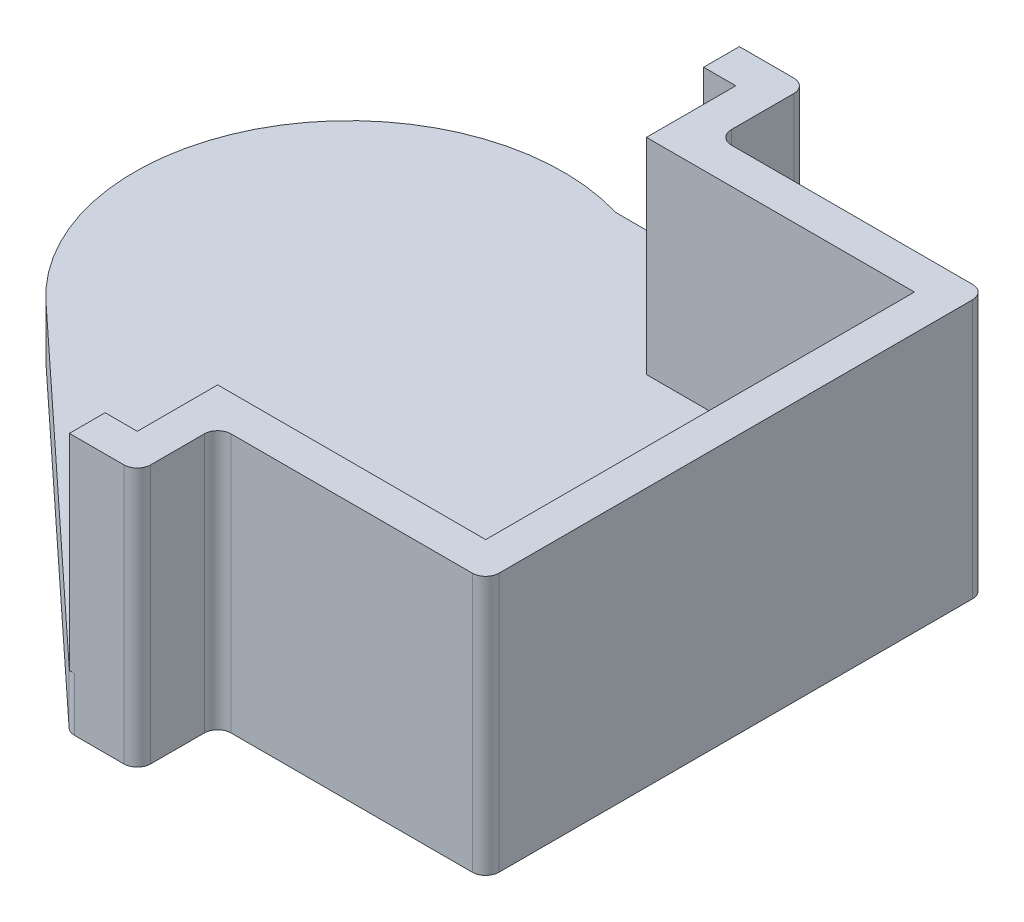
ISO-10303-21;
HEADER;
FILE_DESCRIPTION(('STEP AP214'),'2;1');
FILE_NAME('part.step','',(''),(''),'','','');
FILE_SCHEMA(('AUTOMOTIVE_DESIGN { 1 0 10303 214 1 1 1 1 }'));
ENDSEC;
DATA;
#1=APPLICATION_CONTEXT('core data for automotive mechanical design processes');
#2=APPLICATION_PROTOCOL_DEFINITION('international standard','automotive_design',2000,#1);
#3=PRODUCT_CONTEXT('',#1,'mechanical');
#4=PRODUCT('Part','Part','',(#3));
#5=PRODUCT_RELATED_PRODUCT_CATEGORY('part','',(#4));
#6=PRODUCT_DEFINITION_FORMATION('','',#4);
#7=PRODUCT_DEFINITION_CONTEXT('part definition',#1,'design');
#8=PRODUCT_DEFINITION('design','',#6,#7);
#9=PRODUCT_DEFINITION_SHAPE('','',#8);
#10=(LENGTH_UNIT() NAMED_UNIT(*) SI_UNIT(.MILLI.,.METRE.));
#11=(NAMED_UNIT(*) PLANE_ANGLE_UNIT() SI_UNIT($,.RADIAN.));
#12=(NAMED_UNIT(*) SI_UNIT($,.STERADIAN.) SOLID_ANGLE_UNIT());
#13=UNCERTAINTY_MEASURE_WITH_UNIT(LENGTH_MEASURE(1.E-05),#10,'distance_accuracy_value','');
#14=(GEOMETRIC_REPRESENTATION_CONTEXT(3) GLOBAL_UNCERTAINTY_ASSIGNED_CONTEXT((#13)) GLOBAL_UNIT_ASSIGNED_CONTEXT((#10,
#11,#12)) REPRESENTATION_CONTEXT('',''));
#15=CARTESIAN_POINT('',(0.,0.,0.));
#16=DIRECTION('',(0.,0.,1.));
#17=DIRECTION('',(1.,0.,0.));
#18=AXIS2_PLACEMENT_3D('',#15,#16,#17);
#19=CARTESIAN_POINT('',(6.4,11.5,6.25));
#20=DIRECTION('',(0.,-1.,0.));
#21=DIRECTION('',(0.,0.,-1.));
#22=AXIS2_PLACEMENT_3D('',#19,#20,#21);
#23=CYLINDRICAL_SURFACE('',#22,0.75);
#24=DIRECTION('',(0.,-1.,0.));
#25=VECTOR('',#24,1.);
#26=CARTESIAN_POINT('',(6.39999999999999,11.5,7.));
#27=LINE('',#26,#25);
#28=CARTESIAN_POINT('',(6.39999999999999,11.5,7.));
#29=VERTEX_POINT('',#28);
#30=CARTESIAN_POINT('',(6.39999999999999,-3.,7.));
#31=VERTEX_POINT('',#30);
#32=EDGE_CURVE('E65',#29,#31,#27,.T.);
#33=ORIENTED_EDGE('',*,*,#32,.T.);
#34=CARTESIAN_POINT('',(6.4,-3.,6.25));
#35=DIRECTION('',(0.,1.,0.));
#36=DIRECTION('',(0.,0.,-1.));
#37=AXIS2_PLACEMENT_3D('',#34,#35,#36);
#38=CIRCLE('',#37,0.75);
#39=CARTESIAN_POINT('',(7.15,-3.,6.25));
#40=VERTEX_POINT('',#39);
#41=EDGE_CURVE('E282',#31,#40,#38,.T.);
#42=ORIENTED_EDGE('',*,*,#41,.T.);
#43=DIRECTION('',(0.,-1.,0.));
#44=VECTOR('',#43,1.);
#45=CARTESIAN_POINT('',(7.15,11.5,6.24999999999999));
#46=LINE('',#45,#44);
#47=CARTESIAN_POINT('',(7.15,11.5,6.24999999999999));
#48=VERTEX_POINT('',#47);
#49=EDGE_CURVE('E44',#48,#40,#46,.T.);
#50=ORIENTED_EDGE('',*,*,#49,.F.);
#51=CARTESIAN_POINT('',(6.4,11.5,6.25));
#52=DIRECTION('',(0.,1.,0.));
#53=DIRECTION('',(0.,0.,1.));
#54=AXIS2_PLACEMENT_3D('',#51,#52,#53);
#55=CIRCLE('',#54,0.75);
#56=EDGE_CURVE('E205',#48,#29,#55,.F.);
#57=ORIENTED_EDGE('',*,*,#56,.T.);
#58=EDGE_LOOP('',(#33,#42,#50,#57));
#59=FACE_BOUND('',#58,.T.);
#60=ADVANCED_FACE('F41',(#59),#23,.T.);
#61=CARTESIAN_POINT('',(7.15,11.5,0.));
#62=DIRECTION('',(1.,0.,0.));
#63=DIRECTION('',(0.,0.,-1.));
#64=AXIS2_PLACEMENT_3D('',#61,#62,#63);
#65=PLANE('',#64);
#66=ORIENTED_EDGE('',*,*,#49,.T.);
#67=DIRECTION('',(0.,0.,-1.));
#68=VECTOR('',#67,1.);
#69=CARTESIAN_POINT('',(7.15,-3.,3.25000000000001));
#70=LINE('',#69,#68);
#71=CARTESIAN_POINT('',(7.15,-3.,3.25000000000001));
#72=VERTEX_POINT('',#71);
#73=EDGE_CURVE('E270',#40,#72,#70,.T.);
#74=ORIENTED_EDGE('',*,*,#73,.T.);
#75=DIRECTION('',(0.,-1.,0.));
#76=VECTOR('',#75,1.);
#77=CARTESIAN_POINT('',(7.15,11.5,3.25000000000001));
#78=LINE('',#77,#76);
#79=CARTESIAN_POINT('',(7.15,11.5,3.25000000000001));
#80=VERTEX_POINT('',#79);
#81=EDGE_CURVE('E256',#80,#72,#78,.T.);
#82=ORIENTED_EDGE('',*,*,#81,.F.);
#83=DIRECTION('',(0.,0.,1.));
#84=VECTOR('',#83,1.);
#85=CARTESIAN_POINT('',(7.15,11.5,0.));
#86=LINE('',#85,#84);
#87=EDGE_CURVE('E272',#80,#48,#86,.T.);
#88=ORIENTED_EDGE('',*,*,#87,.T.);
#89=EDGE_LOOP('',(#66,#74,#82,#88));
#90=FACE_BOUND('',#89,.T.);
#91=ADVANCED_FACE('F269',(#90),#65,.T.);
#92=CARTESIAN_POINT('',(7.9,11.5,3.25));
#93=DIRECTION('',(0.,-1.,0.));
#94=DIRECTION('',(0.,0.,-1.));
#95=AXIS2_PLACEMENT_3D('',#92,#93,#94);
#96=CYLINDRICAL_SURFACE('',#95,0.75);
#97=ORIENTED_EDGE('',*,*,#81,.T.);
#98=CARTESIAN_POINT('',(7.9,-3.,3.25));
#99=DIRECTION('',(0.,-1.,0.));
#100=DIRECTION('',(0.,0.,1.));
#101=AXIS2_PLACEMENT_3D('',#98,#99,#100);
#102=CIRCLE('',#101,0.75);
#103=CARTESIAN_POINT('',(7.9,-3.,2.5));
#104=VERTEX_POINT('',#103);
#105=EDGE_CURVE('E284',#72,#104,#102,.T.);
#106=ORIENTED_EDGE('',*,*,#105,.T.);
#107=DIRECTION('',(0.,-1.,0.));
#108=VECTOR('',#107,1.);
#109=CARTESIAN_POINT('',(7.9,11.5,2.5));
#110=LINE('',#109,#108);
#111=CARTESIAN_POINT('',(7.9,11.5,2.5));
#112=VERTEX_POINT('',#111);
#113=EDGE_CURVE('E254',#112,#104,#110,.T.);
#114=ORIENTED_EDGE('',*,*,#113,.F.);
#115=CARTESIAN_POINT('',(7.9,11.5,3.25));
#116=DIRECTION('',(0.,1.,0.));
#117=DIRECTION('',(0.,0.,1.));
#118=AXIS2_PLACEMENT_3D('',#115,#116,#117);
#119=CIRCLE('',#118,0.75);
#120=EDGE_CURVE('E356',#112,#80,#119,.T.);
#121=ORIENTED_EDGE('',*,*,#120,.T.);
#122=EDGE_LOOP('',(#97,#106,#114,#121));
#123=FACE_BOUND('',#122,.T.);
#124=ADVANCED_FACE('F431',(#123),#96,.F.);
#125=CARTESIAN_POINT('',(0.,11.5,2.5));
#126=DIRECTION('',(0.,0.,-1.));
#127=DIRECTION('',(-1.,0.,0.));
#128=AXIS2_PLACEMENT_3D('',#125,#126,#127);
#129=PLANE('',#128);
#130=ORIENTED_EDGE('',*,*,#113,.T.);
#131=DIRECTION('',(1.,0.,0.));
#132=VECTOR('',#131,1.);
#133=CARTESIAN_POINT('',(21.4,-3.,2.5));
#134=LINE('',#133,#132);
#135=CARTESIAN_POINT('',(21.4,-3.,2.5));
#136=VERTEX_POINT('',#135);
#137=EDGE_CURVE('E293',#104,#136,#134,.T.);
#138=ORIENTED_EDGE('',*,*,#137,.T.);
#139=DIRECTION('',(0.,-1.,0.));
#140=VECTOR('',#139,1.);
#141=CARTESIAN_POINT('',(21.4,11.5,2.5));
#142=LINE('',#141,#140);
#143=CARTESIAN_POINT('',(21.4,11.5,2.5));
#144=VERTEX_POINT('',#143);
#145=EDGE_CURVE('E251',#144,#136,#142,.T.);
#146=ORIENTED_EDGE('',*,*,#145,.F.);
#147=DIRECTION('',(1.,0.,0.));
#148=VECTOR('',#147,1.);
#149=CARTESIAN_POINT('',(0.,11.5,2.5));
#150=LINE('',#149,#148);
#151=EDGE_CURVE('E358',#112,#144,#150,.T.);
#152=ORIENTED_EDGE('',*,*,#151,.F.);
#153=EDGE_LOOP('',(#130,#138,#146,#152));
#154=FACE_BOUND('',#153,.T.);
#155=ADVANCED_FACE('F435',(#154),#129,.F.);
#156=CARTESIAN_POINT('',(21.4,11.5,1.75));
#157=DIRECTION('',(0.,-1.,0.));
#158=DIRECTION('',(0.,0.,-1.));
#159=AXIS2_PLACEMENT_3D('',#156,#157,#158);
#160=CYLINDRICAL_SURFACE('',#159,0.75);
#161=ORIENTED_EDGE('',*,*,#145,.T.);
#162=CARTESIAN_POINT('',(21.4,-3.,1.75));
#163=DIRECTION('',(0.,1.,0.));
#164=DIRECTION('',(0.,0.,-1.));
#165=AXIS2_PLACEMENT_3D('',#162,#163,#164);
#166=CIRCLE('',#165,0.75);
#167=CARTESIAN_POINT('',(22.15,-3.,1.74999999999999));
#168=VERTEX_POINT('',#167);
#169=EDGE_CURVE('E296',#136,#168,#166,.T.);
#170=ORIENTED_EDGE('',*,*,#169,.T.);
#171=DIRECTION('',(0.,-1.,0.));
#172=VECTOR('',#171,1.);
#173=CARTESIAN_POINT('',(22.15,11.5,1.74999999999999));
#174=LINE('',#173,#172);
#175=CARTESIAN_POINT('',(22.15,11.5,1.74999999999999));
#176=VERTEX_POINT('',#175);
#177=EDGE_CURVE('E248',#176,#168,#174,.T.);
#178=ORIENTED_EDGE('',*,*,#177,.F.);
#179=CARTESIAN_POINT('',(21.4,11.5,1.75));
#180=DIRECTION('',(0.,1.,0.));
#181=DIRECTION('',(0.,0.,1.));
#182=AXIS2_PLACEMENT_3D('',#179,#180,#181);
#183=CIRCLE('',#182,0.75);
#184=EDGE_CURVE('E360',#176,#144,#183,.F.);
#185=ORIENTED_EDGE('',*,*,#184,.T.);
#186=EDGE_LOOP('',(#161,#170,#178,#185));
#187=FACE_BOUND('',#186,.T.);
#188=ADVANCED_FACE('F440',(#187),#160,.T.);
#189=CARTESIAN_POINT('',(22.15,11.5,0.));
#190=DIRECTION('',(-1.,0.,0.));
#191=DIRECTION('',(0.,0.,1.));
#192=AXIS2_PLACEMENT_3D('',#189,#190,#191);
#193=PLANE('',#192);
#194=ORIENTED_EDGE('',*,*,#177,.T.);
#195=DIRECTION('',(0.,0.,-1.));
#196=VECTOR('',#195,1.);
#197=CARTESIAN_POINT('',(22.15,-3.,-24.75));
#198=LINE('',#197,#196);
#199=CARTESIAN_POINT('',(22.15,-3.,-24.75));
#200=VERTEX_POINT('',#199);
#201=EDGE_CURVE('E299',#168,#200,#198,.T.);
#202=ORIENTED_EDGE('',*,*,#201,.T.);
#203=DIRECTION('',(0.,-1.,0.));
#204=VECTOR('',#203,1.);
#205=CARTESIAN_POINT('',(22.15,11.5,-24.75));
#206=LINE('',#205,#204);
#207=CARTESIAN_POINT('',(22.15,11.5,-24.75));
#208=VERTEX_POINT('',#207);
#209=EDGE_CURVE('E245',#208,#200,#206,.T.);
#210=ORIENTED_EDGE('',*,*,#209,.F.);
#211=DIRECTION('',(0.,0.,-1.));
#212=VECTOR('',#211,1.);
#213=CARTESIAN_POINT('',(22.15,11.5,0.));
#214=LINE('',#213,#212);
#215=EDGE_CURVE('E363',#176,#208,#214,.T.);
#216=ORIENTED_EDGE('',*,*,#215,.F.);
#217=EDGE_LOOP('',(#194,#202,#210,#216));
#218=FACE_BOUND('',#217,.T.);
#219=ADVANCED_FACE('F444',(#218),#193,.F.);
#220=CARTESIAN_POINT('',(21.4,11.5,-24.75));
#221=DIRECTION('',(0.,-1.,0.));
#222=DIRECTION('',(0.,0.,-1.));
#223=AXIS2_PLACEMENT_3D('',#220,#221,#222);
#224=CYLINDRICAL_SURFACE('',#223,0.750000000000001);
#225=ORIENTED_EDGE('',*,*,#209,.T.);
#226=CARTESIAN_POINT('',(21.4,-3.,-24.75));
#227=DIRECTION('',(0.,1.,0.));
#228=DIRECTION('',(0.,0.,-1.));
#229=AXIS2_PLACEMENT_3D('',#226,#227,#228);
#230=CIRCLE('',#229,0.750000000000001);
#231=CARTESIAN_POINT('',(21.4,-3.,-25.5));
#232=VERTEX_POINT('',#231);
#233=EDGE_CURVE('E302',#200,#232,#230,.T.);
#234=ORIENTED_EDGE('',*,*,#233,.T.);
#235=DIRECTION('',(0.,-1.,0.));
#236=VECTOR('',#235,1.);
#237=CARTESIAN_POINT('',(21.4,11.5,-25.5));
#238=LINE('',#237,#236);
#239=CARTESIAN_POINT('',(21.4,11.5,-25.5));
#240=VERTEX_POINT('',#239);
#241=EDGE_CURVE('E242',#240,#232,#238,.T.);
#242=ORIENTED_EDGE('',*,*,#241,.F.);
#243=CARTESIAN_POINT('',(21.4,11.5,-24.75));
#244=DIRECTION('',(0.,1.,0.));
#245=DIRECTION('',(0.,0.,1.));
#246=AXIS2_PLACEMENT_3D('',#243,#244,#245);
#247=CIRCLE('',#246,0.750000000000001);
#248=EDGE_CURVE('E365',#240,#208,#247,.F.);
#249=ORIENTED_EDGE('',*,*,#248,.T.);
#250=EDGE_LOOP('',(#225,#234,#242,#249));
#251=FACE_BOUND('',#250,.T.);
#252=ADVANCED_FACE('F448',(#251),#224,.T.);
#253=CARTESIAN_POINT('',(0.,11.5,-25.5));
#254=DIRECTION('',(0.,0.,-1.));
#255=DIRECTION('',(-1.,0.,0.));
#256=AXIS2_PLACEMENT_3D('',#253,#254,#255);
#257=PLANE('',#256);
#258=ORIENTED_EDGE('',*,*,#241,.T.);
#259=DIRECTION('',(-1.,0.,0.));
#260=VECTOR('',#259,1.);
#261=CARTESIAN_POINT('',(7.9,-3.,-25.5));
#262=LINE('',#261,#260);
#263=CARTESIAN_POINT('',(7.9,-3.,-25.5));
#264=VERTEX_POINT('',#263);
#265=EDGE_CURVE('E305',#232,#264,#262,.T.);
#266=ORIENTED_EDGE('',*,*,#265,.T.);
#267=DIRECTION('',(0.,-1.,0.));
#268=VECTOR('',#267,1.);
#269=CARTESIAN_POINT('',(7.9,11.5,-25.5));
#270=LINE('',#269,#268);
#271=CARTESIAN_POINT('',(7.9,11.5,-25.5));
#272=VERTEX_POINT('',#271);
#273=EDGE_CURVE('E239',#272,#264,#270,.T.);
#274=ORIENTED_EDGE('',*,*,#273,.F.);
#275=DIRECTION('',(1.,0.,0.));
#276=VECTOR('',#275,1.);
#277=CARTESIAN_POINT('',(0.,11.5,-25.5));
#278=LINE('',#277,#276);
#279=EDGE_CURVE('E368',#272,#240,#278,.T.);
#280=ORIENTED_EDGE('',*,*,#279,.T.);
#281=EDGE_LOOP('',(#258,#266,#274,#280));
#282=FACE_BOUND('',#281,.T.);
#283=ADVANCED_FACE('F452',(#282),#257,.T.);
#284=CARTESIAN_POINT('',(7.89999999999999,11.5,-26.25));
#285=DIRECTION('',(0.,-1.,0.));
#286=DIRECTION('',(0.,0.,-1.));
#287=AXIS2_PLACEMENT_3D('',#284,#285,#286);
#288=CYLINDRICAL_SURFACE('',#287,0.750000000000001);
#289=ORIENTED_EDGE('',*,*,#273,.T.);
#290=CARTESIAN_POINT('',(7.9,-3.,-26.25));
#291=DIRECTION('',(0.,-1.,0.));
#292=DIRECTION('',(0.,0.,1.));
#293=AXIS2_PLACEMENT_3D('',#290,#291,#292);
#294=CIRCLE('',#293,0.75);
#295=CARTESIAN_POINT('',(7.15,-3.,-26.25));
#296=VERTEX_POINT('',#295);
#297=EDGE_CURVE('E308',#264,#296,#294,.T.);
#298=ORIENTED_EDGE('',*,*,#297,.T.);
#299=DIRECTION('',(0.,-1.,0.));
#300=VECTOR('',#299,1.);
#301=CARTESIAN_POINT('',(7.14999999999999,11.5,-26.25));
#302=LINE('',#301,#300);
#303=CARTESIAN_POINT('',(7.14999999999999,11.5,-26.25));
#304=VERTEX_POINT('',#303);
#305=EDGE_CURVE('E236',#304,#296,#302,.T.);
#306=ORIENTED_EDGE('',*,*,#305,.F.);
#307=CARTESIAN_POINT('',(7.89999999999999,11.5,-26.25));
#308=DIRECTION('',(0.,1.,0.));
#309=DIRECTION('',(0.,0.,1.));
#310=AXIS2_PLACEMENT_3D('',#307,#308,#309);
#311=CIRCLE('',#310,0.750000000000001);
#312=EDGE_CURVE('E371',#304,#272,#311,.T.);
#313=ORIENTED_EDGE('',*,*,#312,.T.);
#314=EDGE_LOOP('',(#289,#298,#306,#313));
#315=FACE_BOUND('',#314,.T.);
#316=ADVANCED_FACE('F456',(#315),#288,.F.);
#317=CARTESIAN_POINT('',(7.14999999999999,11.5,0.));
#318=DIRECTION('',(1.,0.,0.));
#319=DIRECTION('',(0.,0.,-1.));
#320=AXIS2_PLACEMENT_3D('',#317,#318,#319);
#321=PLANE('',#320);
#322=ORIENTED_EDGE('',*,*,#305,.T.);
#323=DIRECTION('',(0.,0.,-1.));
#324=VECTOR('',#323,1.);
#325=CARTESIAN_POINT('',(7.14999999999999,-3.,-29.75));
#326=LINE('',#325,#324);
#327=CARTESIAN_POINT('',(7.14999999999999,-3.,-29.75));
#328=VERTEX_POINT('',#327);
#329=EDGE_CURVE('E311',#296,#328,#326,.T.);
#330=ORIENTED_EDGE('',*,*,#329,.T.);
#331=DIRECTION('',(0.,-1.,0.));
#332=VECTOR('',#331,1.);
#333=CARTESIAN_POINT('',(7.14999999999999,11.5,-29.75));
#334=LINE('',#333,#332);
#335=CARTESIAN_POINT('',(7.14999999999999,11.5,-29.75));
#336=VERTEX_POINT('',#335);
#337=EDGE_CURVE('E233',#336,#328,#334,.T.);
#338=ORIENTED_EDGE('',*,*,#337,.F.);
#339=DIRECTION('',(0.,0.,1.));
#340=VECTOR('',#339,1.);
#341=CARTESIAN_POINT('',(7.14999999999999,11.5,0.));
#342=LINE('',#341,#340);
#343=EDGE_CURVE('E374',#336,#304,#342,.T.);
#344=ORIENTED_EDGE('',*,*,#343,.T.);
#345=EDGE_LOOP('',(#322,#330,#338,#344));
#346=FACE_BOUND('',#345,.T.);
#347=ADVANCED_FACE('F460',(#346),#321,.T.);
#348=CARTESIAN_POINT('',(6.39999999999999,11.5,-29.75));
#349=DIRECTION('',(0.,-1.,0.));
#350=DIRECTION('',(0.,0.,-1.));
#351=AXIS2_PLACEMENT_3D('',#348,#349,#350);
#352=CYLINDRICAL_SURFACE('',#351,0.750000000000001);
#353=ORIENTED_EDGE('',*,*,#337,.T.);
#354=CARTESIAN_POINT('',(6.39999999999999,-3.,-29.75));
#355=DIRECTION('',(0.,1.,0.));
#356=DIRECTION('',(0.,0.,-1.));
#357=AXIS2_PLACEMENT_3D('',#354,#355,#356);
#358=CIRCLE('',#357,0.75);
#359=CARTESIAN_POINT('',(6.39999999999999,-3.,-30.5));
#360=VERTEX_POINT('',#359);
#361=EDGE_CURVE('E314',#328,#360,#358,.T.);
#362=ORIENTED_EDGE('',*,*,#361,.T.);
#363=DIRECTION('',(0.,-1.,0.));
#364=VECTOR('',#363,1.);
#365=CARTESIAN_POINT('',(6.39999999999998,11.5,-30.5));
#366=LINE('',#365,#364);
#367=CARTESIAN_POINT('',(6.39999999999998,11.5,-30.5));
#368=VERTEX_POINT('',#367);
#369=EDGE_CURVE('E230',#368,#360,#366,.T.);
#370=ORIENTED_EDGE('',*,*,#369,.F.);
#371=CARTESIAN_POINT('',(6.39999999999999,11.5,-29.75));
#372=DIRECTION('',(0.,1.,0.));
#373=DIRECTION('',(0.,0.,1.));
#374=AXIS2_PLACEMENT_3D('',#371,#372,#373);
#375=CIRCLE('',#374,0.750000000000001);
#376=EDGE_CURVE('E377',#336,#368,#375,.T.);
#377=ORIENTED_EDGE('',*,*,#376,.F.);
#378=EDGE_LOOP('',(#353,#362,#370,#377));
#379=FACE_BOUND('',#378,.T.);
#380=ADVANCED_FACE('F464',(#379),#352,.T.);
#381=CARTESIAN_POINT('',(0.,11.5,-30.5));
#382=DIRECTION('',(0.,0.,1.));
#383=DIRECTION('',(1.,0.,0.));
#384=AXIS2_PLACEMENT_3D('',#381,#382,#383);
#385=PLANE('',#384);
#386=ORIENTED_EDGE('',*,*,#369,.T.);
#387=DIRECTION('',(-1.,0.,0.));
#388=VECTOR('',#387,1.);
#389=CARTESIAN_POINT('',(-3.46672887899274,-3.,-30.5));
#390=LINE('',#389,#388);
#391=CARTESIAN_POINT('',(-3.46672887899274,-3.,-30.5));
#392=VERTEX_POINT('',#391);
#393=EDGE_CURVE('E317',#360,#392,#390,.T.);
#394=ORIENTED_EDGE('',*,*,#393,.T.);
#395=DIRECTION('',(0.,1.,0.));
#396=VECTOR('',#395,1.);
#397=CARTESIAN_POINT('',(-3.46672887899274,-3.,-30.5));
#398=LINE('',#397,#396);
#399=CARTESIAN_POINT('',(-3.46672887899274,0.,-30.5));
#400=VERTEX_POINT('',#399);
#401=EDGE_CURVE('E350',#392,#400,#398,.T.);
#402=ORIENTED_EDGE('',*,*,#401,.T.);
#403=DIRECTION('',(-1.,0.,0.));
#404=VECTOR('',#403,1.);
#405=CARTESIAN_POINT('',(-3.46672887899274,0.,-30.5));
#406=LINE('',#405,#404);
#407=CARTESIAN_POINT('',(3.35,0.,-30.5));
#408=VERTEX_POINT('',#407);
#409=EDGE_CURVE('E329',#408,#400,#406,.T.);
#410=ORIENTED_EDGE('',*,*,#409,.F.);
#411=DIRECTION('',(0.,-1.,0.));
#412=VECTOR('',#411,1.);
#413=CARTESIAN_POINT('',(3.35,11.5,-30.5));
#414=LINE('',#413,#412);
#415=CARTESIAN_POINT('',(3.35,11.5,-30.5));
#416=VERTEX_POINT('',#415);
#417=EDGE_CURVE('E227',#416,#408,#414,.T.);
#418=ORIENTED_EDGE('',*,*,#417,.F.);
#419=DIRECTION('',(-1.,0.,0.));
#420=VECTOR('',#419,1.);
#421=CARTESIAN_POINT('',(0.,11.5,-30.5));
#422=LINE('',#421,#420);
#423=EDGE_CURVE('E379',#368,#416,#422,.T.);
#424=ORIENTED_EDGE('',*,*,#423,.F.);
#425=EDGE_LOOP('',(#386,#394,#402,#410,#418,#424));
#426=FACE_BOUND('',#425,.T.);
#427=ADVANCED_FACE('F468',(#426),#385,.F.);
#428=CARTESIAN_POINT('',(3.35,11.5,0.));
#429=DIRECTION('',(1.,0.,0.));
#430=DIRECTION('',(0.,0.,-1.));
#431=AXIS2_PLACEMENT_3D('',#428,#429,#430);
#432=PLANE('',#431);
#433=DIRECTION('',(0.,0.,1.));
#434=VECTOR('',#433,1.);
#435=CARTESIAN_POINT('',(3.35,0.,0.));
#436=LINE('',#435,#434);
#437=CARTESIAN_POINT('',(3.35,0.,-28.5));
#438=VERTEX_POINT('',#437);
#439=EDGE_CURVE('E179',#408,#438,#436,.T.);
#440=ORIENTED_EDGE('',*,*,#439,.T.);
#441=DIRECTION('',(0.,-1.,0.));
#442=VECTOR('',#441,1.);
#443=CARTESIAN_POINT('',(3.35,11.5,-28.5));
#444=LINE('',#443,#442);
#445=CARTESIAN_POINT('',(3.35,11.5,-28.5));
#446=VERTEX_POINT('',#445);
#447=EDGE_CURVE('E224',#446,#438,#444,.T.);
#448=ORIENTED_EDGE('',*,*,#447,.F.);
#449=DIRECTION('',(0.,0.,1.));
#450=VECTOR('',#449,1.);
#451=CARTESIAN_POINT('',(3.35,11.5,0.));
#452=LINE('',#451,#450);
#453=EDGE_CURVE('E381',#416,#446,#452,.T.);
#454=ORIENTED_EDGE('',*,*,#453,.F.);
#455=ORIENTED_EDGE('',*,*,#417,.T.);
#456=EDGE_LOOP('',(#440,#448,#454,#455));
#457=FACE_BOUND('',#456,.T.);
#458=ADVANCED_FACE('F472',(#457),#432,.F.);
#459=CARTESIAN_POINT('',(0.,11.5,-28.5));
#460=DIRECTION('',(0.,0.,-1.));
#461=DIRECTION('',(-1.,0.,0.));
#462=AXIS2_PLACEMENT_3D('',#459,#460,#461);
#463=PLANE('',#462);
#464=DIRECTION('',(1.,0.,0.));
#465=VECTOR('',#464,1.);
#466=CARTESIAN_POINT('',(0.,0.,-28.5));
#467=LINE('',#466,#465);
#468=CARTESIAN_POINT('',(5.14999999999999,0.,-28.5));
#469=VERTEX_POINT('',#468);
#470=EDGE_CURVE('E182',#438,#469,#467,.T.);
#471=ORIENTED_EDGE('',*,*,#470,.T.);
#472=DIRECTION('',(0.,-1.,0.));
#473=VECTOR('',#472,1.);
#474=CARTESIAN_POINT('',(5.14999999999999,11.5,-28.5));
#475=LINE('',#474,#473);
#476=CARTESIAN_POINT('',(5.14999999999999,11.5,-28.5));
#477=VERTEX_POINT('',#476);
#478=EDGE_CURVE('E221',#477,#469,#475,.T.);
#479=ORIENTED_EDGE('',*,*,#478,.F.);
#480=DIRECTION('',(1.,0.,0.));
#481=VECTOR('',#480,1.);
#482=CARTESIAN_POINT('',(0.,11.5,-28.5));
#483=LINE('',#482,#481);
#484=EDGE_CURVE('E383',#446,#477,#483,.T.);
#485=ORIENTED_EDGE('',*,*,#484,.F.);
#486=ORIENTED_EDGE('',*,*,#447,.T.);
#487=EDGE_LOOP('',(#471,#479,#485,#486));
#488=FACE_BOUND('',#487,.T.);
#489=ADVANCED_FACE('F476',(#488),#463,.F.);
#490=CARTESIAN_POINT('',(5.15000000000044,11.5,0.));
#491=DIRECTION('',(-1.,0.,0.));
#492=DIRECTION('',(0.,0.,1.));
#493=AXIS2_PLACEMENT_3D('',#490,#491,#492);
#494=PLANE('',#493);
#495=DIRECTION('',(0.,0.,-1.));
#496=VECTOR('',#495,1.);
#497=CARTESIAN_POINT('',(5.15000000000044,0.,0.));
#498=LINE('',#497,#496);
#499=CARTESIAN_POINT('',(5.14999999999999,0.,-23.5));
#500=VERTEX_POINT('',#499);
#501=EDGE_CURVE('E186',#500,#469,#498,.T.);
#502=ORIENTED_EDGE('',*,*,#501,.F.);
#503=DIRECTION('',(0.,-1.,0.));
#504=VECTOR('',#503,1.);
#505=CARTESIAN_POINT('',(5.14999999999999,11.5,-23.5));
#506=LINE('',#505,#504);
#507=CARTESIAN_POINT('',(5.14999999999999,11.5,-23.5));
#508=VERTEX_POINT('',#507);
#509=EDGE_CURVE('E218',#508,#500,#506,.T.);
#510=ORIENTED_EDGE('',*,*,#509,.F.);
#511=DIRECTION('',(0.,0.,-1.));
#512=VECTOR('',#511,1.);
#513=CARTESIAN_POINT('',(5.15000000000044,11.5,0.));
#514=LINE('',#513,#512);
#515=EDGE_CURVE('E385',#508,#477,#514,.T.);
#516=ORIENTED_EDGE('',*,*,#515,.T.);
#517=ORIENTED_EDGE('',*,*,#478,.T.);
#518=EDGE_LOOP('',(#502,#510,#516,#517));
#519=FACE_BOUND('',#518,.T.);
#520=ADVANCED_FACE('F480',(#519),#494,.T.);
#521=CARTESIAN_POINT('',(0.,11.5,-23.5));
#522=DIRECTION('',(0.,0.,-1.));
#523=DIRECTION('',(-1.,0.,0.));
#524=AXIS2_PLACEMENT_3D('',#521,#522,#523);
#525=PLANE('',#524);
#526=DIRECTION('',(1.,0.,0.));
#527=VECTOR('',#526,1.);
#528=CARTESIAN_POINT('',(0.,0.,-23.5));
#529=LINE('',#528,#527);
#530=CARTESIAN_POINT('',(20.15,0.,-23.5));
#531=VERTEX_POINT('',#530);
#532=EDGE_CURVE('E189',#500,#531,#529,.T.);
#533=ORIENTED_EDGE('',*,*,#532,.T.);
#534=DIRECTION('',(0.,-1.,0.));
#535=VECTOR('',#534,1.);
#536=CARTESIAN_POINT('',(20.15,11.5,-23.5));
#537=LINE('',#536,#535);
#538=CARTESIAN_POINT('',(20.15,11.5,-23.5));
#539=VERTEX_POINT('',#538);
#540=EDGE_CURVE('E215',#539,#531,#537,.T.);
#541=ORIENTED_EDGE('',*,*,#540,.F.);
#542=DIRECTION('',(1.,0.,0.));
#543=VECTOR('',#542,1.);
#544=CARTESIAN_POINT('',(0.,11.5,-23.5));
#545=LINE('',#544,#543);
#546=EDGE_CURVE('E388',#508,#539,#545,.T.);
#547=ORIENTED_EDGE('',*,*,#546,.F.);
#548=ORIENTED_EDGE('',*,*,#509,.T.);
#549=EDGE_LOOP('',(#533,#541,#547,#548));
#550=FACE_BOUND('',#549,.T.);
#551=ADVANCED_FACE('F484',(#550),#525,.F.);
#552=CARTESIAN_POINT('',(20.15,11.5,0.));
#553=DIRECTION('',(-1.,0.,0.));
#554=DIRECTION('',(0.,0.,1.));
#555=AXIS2_PLACEMENT_3D('',#552,#553,#554);
#556=PLANE('',#555);
#557=DIRECTION('',(0.,0.,-1.));
#558=VECTOR('',#557,1.);
#559=CARTESIAN_POINT('',(20.15,0.,0.));
#560=LINE('',#559,#558);
#561=CARTESIAN_POINT('',(20.15,0.,0.5));
#562=VERTEX_POINT('',#561);
#563=EDGE_CURVE('E192',#562,#531,#560,.T.);
#564=ORIENTED_EDGE('',*,*,#563,.F.);
#565=DIRECTION('',(0.,-1.,0.));
#566=VECTOR('',#565,1.);
#567=CARTESIAN_POINT('',(20.15,11.5,0.5));
#568=LINE('',#567,#566);
#569=CARTESIAN_POINT('',(20.15,11.5,0.5));
#570=VERTEX_POINT('',#569);
#571=EDGE_CURVE('E212',#570,#562,#568,.T.);
#572=ORIENTED_EDGE('',*,*,#571,.F.);
#573=DIRECTION('',(0.,0.,-1.));
#574=VECTOR('',#573,1.);
#575=CARTESIAN_POINT('',(20.15,11.5,0.));
#576=LINE('',#575,#574);
#577=EDGE_CURVE('E390',#570,#539,#576,.T.);
#578=ORIENTED_EDGE('',*,*,#577,.T.);
#579=ORIENTED_EDGE('',*,*,#540,.T.);
#580=EDGE_LOOP('',(#564,#572,#578,#579));
#581=FACE_BOUND('',#580,.T.);
#582=ADVANCED_FACE('F405',(#581),#556,.T.);
#583=CARTESIAN_POINT('',(0.,11.5,0.5));
#584=DIRECTION('',(0.,0.,-1.));
#585=DIRECTION('',(-1.,0.,0.));
#586=AXIS2_PLACEMENT_3D('',#583,#584,#585);
#587=PLANE('',#586);
#588=DIRECTION('',(1.,0.,0.));
#589=VECTOR('',#588,1.);
#590=CARTESIAN_POINT('',(0.,0.,0.5));
#591=LINE('',#590,#589);
#592=CARTESIAN_POINT('',(5.15,0.,0.5));
#593=VERTEX_POINT('',#592);
#594=EDGE_CURVE('E195',#593,#562,#591,.T.);
#595=ORIENTED_EDGE('',*,*,#594,.F.);
#596=DIRECTION('',(0.,-1.,0.));
#597=VECTOR('',#596,1.);
#598=CARTESIAN_POINT('',(5.15,11.5,0.5));
#599=LINE('',#598,#597);
#600=CARTESIAN_POINT('',(5.15,11.5,0.5));
#601=VERTEX_POINT('',#600);
#602=EDGE_CURVE('E209',#601,#593,#599,.T.);
#603=ORIENTED_EDGE('',*,*,#602,.F.);
#604=DIRECTION('',(1.,0.,0.));
#605=VECTOR('',#604,1.);
#606=CARTESIAN_POINT('',(0.,11.5,0.5));
#607=LINE('',#606,#605);
#608=EDGE_CURVE('E393',#601,#570,#607,.T.);
#609=ORIENTED_EDGE('',*,*,#608,.T.);
#610=ORIENTED_EDGE('',*,*,#571,.T.);
#611=EDGE_LOOP('',(#595,#603,#609,#610));
#612=FACE_BOUND('',#611,.T.);
#613=ADVANCED_FACE('F397',(#612),#587,.T.);
#614=CARTESIAN_POINT('',(5.15,11.5,0.));
#615=DIRECTION('',(1.,0.,0.));
#616=DIRECTION('',(0.,0.,-1.));
#617=AXIS2_PLACEMENT_3D('',#614,#615,#616);
#618=PLANE('',#617);
#619=DIRECTION('',(0.,0.,1.));
#620=VECTOR('',#619,1.);
#621=CARTESIAN_POINT('',(5.15,0.,0.));
#622=LINE('',#621,#620);
#623=CARTESIAN_POINT('',(5.15,0.,5.));
#624=VERTEX_POINT('',#623);
#625=EDGE_CURVE('E198',#593,#624,#622,.T.);
#626=ORIENTED_EDGE('',*,*,#625,.T.);
#627=DIRECTION('',(0.,-1.,0.));
#628=VECTOR('',#627,1.);
#629=CARTESIAN_POINT('',(5.15,11.5,5.));
#630=LINE('',#629,#628);
#631=CARTESIAN_POINT('',(5.15,11.5,5.));
#632=VERTEX_POINT('',#631);
#633=EDGE_CURVE('E169',#632,#624,#630,.T.);
#634=ORIENTED_EDGE('',*,*,#633,.F.);
#635=DIRECTION('',(0.,0.,1.));
#636=VECTOR('',#635,1.);
#637=CARTESIAN_POINT('',(5.15,11.5,0.));
#638=LINE('',#637,#636);
#639=EDGE_CURVE('E160',#601,#632,#638,.T.);
#640=ORIENTED_EDGE('',*,*,#639,.F.);
#641=ORIENTED_EDGE('',*,*,#602,.T.);
#642=EDGE_LOOP('',(#626,#634,#640,#641));
#643=FACE_BOUND('',#642,.T.);
#644=ADVANCED_FACE('F417',(#643),#618,.F.);
#645=CARTESIAN_POINT('',(0.,11.5,5.));
#646=DIRECTION('',(0.,0.,1.));
#647=DIRECTION('',(1.,0.,0.));
#648=AXIS2_PLACEMENT_3D('',#645,#646,#647);
#649=PLANE('',#648);
#650=DIRECTION('',(-1.,0.,0.));
#651=VECTOR('',#650,1.);
#652=CARTESIAN_POINT('',(0.,0.,5.));
#653=LINE('',#652,#651);
#654=CARTESIAN_POINT('',(3.35,0.,5.));
#655=VERTEX_POINT('',#654);
#656=EDGE_CURVE('E168',#624,#655,#653,.T.);
#657=ORIENTED_EDGE('',*,*,#656,.T.);
#658=DIRECTION('',(0.,-1.,0.));
#659=VECTOR('',#658,1.);
#660=CARTESIAN_POINT('',(3.35,11.5,5.));
#661=LINE('',#660,#659);
#662=CARTESIAN_POINT('',(3.35,11.5,5.));
#663=VERTEX_POINT('',#662);
#664=EDGE_CURVE('E166',#663,#655,#661,.T.);
#665=ORIENTED_EDGE('',*,*,#664,.F.);
#666=DIRECTION('',(-1.,0.,0.));
#667=VECTOR('',#666,1.);
#668=CARTESIAN_POINT('',(0.,11.5,5.));
#669=LINE('',#668,#667);
#670=EDGE_CURVE('E151',#632,#663,#669,.T.);
#671=ORIENTED_EDGE('',*,*,#670,.F.);
#672=ORIENTED_EDGE('',*,*,#633,.T.);
#673=EDGE_LOOP('',(#657,#665,#671,#672));
#674=FACE_BOUND('',#673,.T.);
#675=ADVANCED_FACE('F167',(#674),#649,.F.);
#676=CARTESIAN_POINT('',(3.35,11.5,0.));
#677=DIRECTION('',(1.,0.,0.));
#678=DIRECTION('',(0.,0.,-1.));
#679=AXIS2_PLACEMENT_3D('',#676,#677,#678);
#680=PLANE('',#679);
#681=DIRECTION('',(0.,0.,1.));
#682=VECTOR('',#681,1.);
#683=CARTESIAN_POINT('',(3.35,0.,0.));
#684=LINE('',#683,#682);
#685=CARTESIAN_POINT('',(3.35,0.,6.93968537603666));
#686=VERTEX_POINT('',#685);
#687=EDGE_CURVE('E90',#655,#686,#684,.T.);
#688=ORIENTED_EDGE('',*,*,#687,.T.);
#689=CARTESIAN_POINT('',(3.35,0.,7.));
#690=VERTEX_POINT('',#689);
#691=EDGE_CURVE('E79',#686,#690,#684,.T.);
#692=ORIENTED_EDGE('',*,*,#691,.T.);
#693=DIRECTION('',(0.,-1.,0.));
#694=VECTOR('',#693,1.);
#695=CARTESIAN_POINT('',(3.35,11.5,7.));
#696=LINE('',#695,#694);
#697=CARTESIAN_POINT('',(3.35,11.5,7.));
#698=VERTEX_POINT('',#697);
#699=EDGE_CURVE('E170',#698,#690,#696,.T.);
#700=ORIENTED_EDGE('',*,*,#699,.F.);
#701=DIRECTION('',(0.,0.,1.));
#702=VECTOR('',#701,1.);
#703=CARTESIAN_POINT('',(3.35,11.5,0.));
#704=LINE('',#703,#702);
#705=EDGE_CURVE('E157',#663,#698,#704,.T.);
#706=ORIENTED_EDGE('',*,*,#705,.F.);
#707=ORIENTED_EDGE('',*,*,#664,.T.);
#708=EDGE_LOOP('',(#688,#692,#700,#706,#707));
#709=FACE_BOUND('',#708,.T.);
#710=ADVANCED_FACE('F172',(#709),#680,.F.);
#711=CARTESIAN_POINT('',(0.,11.5,7.));
#712=DIRECTION('',(0.,0.,1.));
#713=DIRECTION('',(1.,0.,0.));
#714=AXIS2_PLACEMENT_3D('',#711,#712,#713);
#715=PLANE('',#714);
#716=DIRECTION('',(-1.,0.,0.));
#717=VECTOR('',#716,1.);
#718=CARTESIAN_POINT('',(0.,0.,7.));
#719=LINE('',#718,#717);
#720=CARTESIAN_POINT('',(3.64467623263707,0.,7.));
#721=VERTEX_POINT('',#720);
#722=EDGE_CURVE('E203',#721,#690,#719,.T.);
#723=ORIENTED_EDGE('',*,*,#722,.F.);
#724=DIRECTION('',(0.,1.,0.));
#725=VECTOR('',#724,1.);
#726=CARTESIAN_POINT('',(3.64467623263707,-3.,7.));
#727=LINE('',#726,#725);
#728=CARTESIAN_POINT('',(3.64467623263707,-3.,7.));
#729=VERTEX_POINT('',#728);
#730=EDGE_CURVE('E57',#729,#721,#727,.T.);
#731=ORIENTED_EDGE('',*,*,#730,.F.);
#732=DIRECTION('',(1.,0.,0.));
#733=VECTOR('',#732,1.);
#734=CARTESIAN_POINT('',(6.39999999999999,-3.,7.));
#735=LINE('',#734,#733);
#736=EDGE_CURVE('E286',#729,#31,#735,.T.);
#737=ORIENTED_EDGE('',*,*,#736,.T.);
#738=ORIENTED_EDGE('',*,*,#32,.F.);
#739=DIRECTION('',(-1.,0.,0.));
#740=VECTOR('',#739,1.);
#741=CARTESIAN_POINT('',(0.,11.5,7.));
#742=LINE('',#741,#740);
#743=EDGE_CURVE('E174',#29,#698,#742,.T.);
#744=ORIENTED_EDGE('',*,*,#743,.T.);
#745=ORIENTED_EDGE('',*,*,#699,.T.);
#746=EDGE_LOOP('',(#723,#731,#737,#738,#744,#745));
#747=FACE_BOUND('',#746,.T.);
#748=ADVANCED_FACE('F531',(#747),#715,.T.);
#749=CARTESIAN_POINT('',(0.,11.5,0.));
#750=DIRECTION('',(0.,1.,0.));
#751=DIRECTION('',(0.,0.,1.));
#752=AXIS2_PLACEMENT_3D('',#749,#750,#751);
#753=PLANE('',#752);
#754=ORIENTED_EDGE('',*,*,#56,.F.);
#755=ORIENTED_EDGE('',*,*,#87,.F.);
#756=ORIENTED_EDGE('',*,*,#120,.F.);
#757=ORIENTED_EDGE('',*,*,#151,.T.);
#758=ORIENTED_EDGE('',*,*,#184,.F.);
#759=ORIENTED_EDGE('',*,*,#215,.T.);
#760=ORIENTED_EDGE('',*,*,#248,.F.);
#761=ORIENTED_EDGE('',*,*,#279,.F.);
#762=ORIENTED_EDGE('',*,*,#312,.F.);
#763=ORIENTED_EDGE('',*,*,#343,.F.);
#764=ORIENTED_EDGE('',*,*,#376,.T.);
#765=ORIENTED_EDGE('',*,*,#423,.T.);
#766=ORIENTED_EDGE('',*,*,#453,.T.);
#767=ORIENTED_EDGE('',*,*,#484,.T.);
#768=ORIENTED_EDGE('',*,*,#515,.F.);
#769=ORIENTED_EDGE('',*,*,#546,.T.);
#770=ORIENTED_EDGE('',*,*,#577,.F.);
#771=ORIENTED_EDGE('',*,*,#608,.F.);
#772=ORIENTED_EDGE('',*,*,#639,.T.);
#773=ORIENTED_EDGE('',*,*,#670,.T.);
#774=ORIENTED_EDGE('',*,*,#705,.T.);
#775=ORIENTED_EDGE('',*,*,#743,.F.);
#776=EDGE_LOOP('',(#754,#755,#756,#757,#758,#759,#760,#761,#762,#763,#764,#765,#766,#767,#768,
#769,#770,#771,#772,#773,#774,#775));
#777=FACE_BOUND('',#776,.T.);
#778=ADVANCED_FACE('F154',(#777),#753,.T.);
#779=CARTESIAN_POINT('',(0.,0.,0.));
#780=DIRECTION('',(0.,1.,0.));
#781=DIRECTION('',(0.,0.,1.));
#782=AXIS2_PLACEMENT_3D('',#779,#780,#781);
#783=PLANE('',#782);
#784=ORIENTED_EDGE('',*,*,#691,.F.);
#785=CARTESIAN_POINT('',(3.64467623263707,0.,6.25));
#786=DIRECTION('',(0.,1.,0.));
#787=DIRECTION('',(0.,0.,1.));
#788=AXIS2_PLACEMENT_3D('',#785,#786,#787);
#789=CIRCLE('',#788,0.75);
#790=EDGE_CURVE('E11',#686,#721,#789,.T.);
#791=ORIENTED_EDGE('',*,*,#790,.T.);
#792=ORIENTED_EDGE('',*,*,#722,.T.);
#793=EDGE_LOOP('',(#784,#791,#792));
#794=FACE_BOUND('',#793,.T.);
#795=ADVANCED_FACE('F554',(#794),#783,.F.);
#796=CARTESIAN_POINT('',(3.64467623263707,0.,6.25));
#797=DIRECTION('',(0.,1.,0.));
#798=DIRECTION('',(0.,0.,1.));
#799=AXIS2_PLACEMENT_3D('',#796,#797,#798);
#800=PLANE('',#799);
#801=ORIENTED_EDGE('',*,*,#687,.F.);
#802=ORIENTED_EDGE('',*,*,#656,.F.);
#803=ORIENTED_EDGE('',*,*,#625,.F.);
#804=ORIENTED_EDGE('',*,*,#594,.T.);
#805=ORIENTED_EDGE('',*,*,#563,.T.);
#806=ORIENTED_EDGE('',*,*,#532,.F.);
#807=ORIENTED_EDGE('',*,*,#501,.T.);
#808=ORIENTED_EDGE('',*,*,#470,.F.);
#809=ORIENTED_EDGE('',*,*,#439,.F.);
#810=ORIENTED_EDGE('',*,*,#409,.T.);
#811=CARTESIAN_POINT('',(-3.46672887899274,0.,-31.25));
#812=DIRECTION('',(0.,-1.,0.));
#813=DIRECTION('',(0.,0.,-1.));
#814=AXIS2_PLACEMENT_3D('',#811,#812,#813);
#815=CIRCLE('',#814,0.750000000000003);
#816=CARTESIAN_POINT('',(-3.67459649950522,0.,-30.5293814793232));
#817=VERTEX_POINT('',#816);
#818=EDGE_CURVE('E333',#400,#817,#815,.T.);
#819=ORIENTED_EDGE('',*,*,#818,.T.);
#820=CARTESIAN_POINT('',(-7.00047842770483,0.,-18.9994851484937));
#821=DIRECTION('',(0.,1.,0.));
#822=DIRECTION('',(0.,0.,1.));
#823=AXIS2_PLACEMENT_3D('',#820,#821,#822);
#824=CIRCLE('',#823,12.);
#825=CARTESIAN_POINT('',(-15.1691120076131,0.,-10.2089547073204));
#826=VERTEX_POINT('',#825);
#827=EDGE_CURVE('E336',#817,#826,#824,.T.);
#828=ORIENTED_EDGE('',*,*,#827,.T.);
#829=DIRECTION('',(0.732544203431107,0.,0.68071946499236));
#830=VECTOR('',#829,1.);
#831=CARTESIAN_POINT('',(3.1341366338928,0.,6.79940815257333));
#832=LINE('',#831,#830);
#833=CARTESIAN_POINT('',(3.1341366338928,0.,6.79940815257333));
#834=VERTEX_POINT('',#833);
#835=EDGE_CURVE('E339',#826,#834,#832,.T.);
#836=ORIENTED_EDGE('',*,*,#835,.T.);
#837=EDGE_CURVE('E50',#834,#686,#789,.T.);
#838=ORIENTED_EDGE('',*,*,#837,.T.);
#839=EDGE_LOOP('',(#801,#802,#803,#804,#805,#806,#807,#808,#809,#810,#819,#828,#836,#838));
#840=FACE_BOUND('',#839,.T.);
#841=ADVANCED_FACE('F409',(#840),#800,.T.);
#842=CARTESIAN_POINT('',(3.64467623263707,-3.,6.25));
#843=DIRECTION('',(0.,1.,0.));
#844=DIRECTION('',(0.,0.,1.));
#845=AXIS2_PLACEMENT_3D('',#842,#843,#844);
#846=CYLINDRICAL_SURFACE('',#845,0.75);
#847=ORIENTED_EDGE('',*,*,#837,.F.);
#848=DIRECTION('',(0.,1.,0.));
#849=VECTOR('',#848,1.);
#850=CARTESIAN_POINT('',(3.1341366338928,-3.,6.79940815257333));
#851=LINE('',#850,#849);
#852=CARTESIAN_POINT('',(3.1341366338928,-3.,6.79940815257333));
#853=VERTEX_POINT('',#852);
#854=EDGE_CURVE('E183',#853,#834,#851,.T.);
#855=ORIENTED_EDGE('',*,*,#854,.F.);
#856=CARTESIAN_POINT('',(3.64467623263707,-3.,6.25));
#857=DIRECTION('',(0.,1.,0.));
#858=DIRECTION('',(0.,0.,1.));
#859=AXIS2_PLACEMENT_3D('',#856,#857,#858);
#860=CIRCLE('',#859,0.75);
#861=EDGE_CURVE('E288',#853,#729,#860,.T.);
#862=ORIENTED_EDGE('',*,*,#861,.T.);
#863=ORIENTED_EDGE('',*,*,#730,.T.);
#864=ORIENTED_EDGE('',*,*,#790,.F.);
#865=EDGE_LOOP('',(#847,#855,#862,#863,#864));
#866=FACE_BOUND('',#865,.T.);
#867=ADVANCED_FACE('F718',(#866),#846,.T.);
#868=CARTESIAN_POINT('',(3.1341366338928,-3.,6.79940815257333));
#869=DIRECTION('',(-0.68071946499236,0.,0.732544203431107));
#870=DIRECTION('',(0.732544203431107,0.,0.68071946499236));
#871=AXIS2_PLACEMENT_3D('',#868,#869,#870);
#872=PLANE('',#871);
#873=ORIENTED_EDGE('',*,*,#835,.F.);
#874=DIRECTION('',(0.,1.,0.));
#875=VECTOR('',#874,1.);
#876=CARTESIAN_POINT('',(-15.1691120076131,-3.,-10.2089547073204));
#877=LINE('',#876,#875);
#878=CARTESIAN_POINT('',(-15.1691120076131,-3.,-10.2089547073204));
#879=VERTEX_POINT('',#878);
#880=EDGE_CURVE('E344',#879,#826,#877,.T.);
#881=ORIENTED_EDGE('',*,*,#880,.F.);
#882=DIRECTION('',(0.732544203431107,0.,0.68071946499236));
#883=VECTOR('',#882,1.);
#884=CARTESIAN_POINT('',(3.1341366338928,-3.,6.79940815257333));
#885=LINE('',#884,#883);
#886=EDGE_CURVE('E326',#879,#853,#885,.T.);
#887=ORIENTED_EDGE('',*,*,#886,.T.);
#888=ORIENTED_EDGE('',*,*,#854,.T.);
#889=EDGE_LOOP('',(#873,#881,#887,#888));
#890=FACE_BOUND('',#889,.T.);
#891=ADVANCED_FACE('F725',(#890),#872,.T.);
#892=CARTESIAN_POINT('',(-7.00047842770483,-3.,-18.9994851484937));
#893=DIRECTION('',(0.,1.,0.));
#894=DIRECTION('',(0.,0.,1.));
#895=AXIS2_PLACEMENT_3D('',#892,#893,#894);
#896=CYLINDRICAL_SURFACE('',#895,12.);
#897=ORIENTED_EDGE('',*,*,#827,.F.);
#898=DIRECTION('',(0.,1.,0.));
#899=VECTOR('',#898,1.);
#900=CARTESIAN_POINT('',(-3.67459649950522,-3.,-30.5293814793232));
#901=LINE('',#900,#899);
#902=CARTESIAN_POINT('',(-3.67459649950522,-3.,-30.5293814793232));
#903=VERTEX_POINT('',#902);
#904=EDGE_CURVE('E347',#903,#817,#901,.T.);
#905=ORIENTED_EDGE('',*,*,#904,.F.);
#906=CARTESIAN_POINT('',(-7.00047842770483,-3.,-18.9994851484937));
#907=DIRECTION('',(0.,1.,0.));
#908=DIRECTION('',(0.,0.,1.));
#909=AXIS2_PLACEMENT_3D('',#906,#907,#908);
#910=CIRCLE('',#909,12.);
#911=EDGE_CURVE('E323',#903,#879,#910,.T.);
#912=ORIENTED_EDGE('',*,*,#911,.T.);
#913=ORIENTED_EDGE('',*,*,#880,.T.);
#914=EDGE_LOOP('',(#897,#905,#912,#913));
#915=FACE_BOUND('',#914,.T.);
#916=ADVANCED_FACE('F733',(#915),#896,.T.);
#917=CARTESIAN_POINT('',(-3.46672887899274,-3.,-31.25));
#918=DIRECTION('',(0.,1.,0.));
#919=DIRECTION('',(0.,0.,1.));
#920=AXIS2_PLACEMENT_3D('',#917,#918,#919);
#921=CYLINDRICAL_SURFACE('',#920,0.750000000000003);
#922=ORIENTED_EDGE('',*,*,#818,.F.);
#923=ORIENTED_EDGE('',*,*,#401,.F.);
#924=CARTESIAN_POINT('',(-3.46672887899274,-3.,-31.25));
#925=DIRECTION('',(0.,-1.,0.));
#926=DIRECTION('',(0.,0.,-1.));
#927=AXIS2_PLACEMENT_3D('',#924,#925,#926);
#928=CIRCLE('',#927,0.750000000000003);
#929=EDGE_CURVE('E320',#392,#903,#928,.T.);
#930=ORIENTED_EDGE('',*,*,#929,.T.);
#931=ORIENTED_EDGE('',*,*,#904,.T.);
#932=EDGE_LOOP('',(#922,#923,#930,#931));
#933=FACE_BOUND('',#932,.T.);
#934=ADVANCED_FACE('F742',(#933),#921,.F.);
#935=CARTESIAN_POINT('',(3.64467623263707,-3.,6.25));
#936=DIRECTION('',(0.,1.,0.));
#937=DIRECTION('',(0.,0.,1.));
#938=AXIS2_PLACEMENT_3D('',#935,#936,#937);
#939=PLANE('',#938);
#940=CARTESIAN_POINT('',(0.0710678118655723,-3.,-19.0000000000001));
#941=DIRECTION('',(0.,1.,0.));
#942=DIRECTION('',(0.,0.,1.));
#943=AXIS2_PLACEMENT_3D('',#940,#941,#942);
#944=CIRCLE('',#943,2.);
#945=CARTESIAN_POINT('',(0.0710678118655723,-3.,-17.0000000000001));
#946=VERTEX_POINT('',#945);
#947=EDGE_CURVE('E852',#946,#946,#944,.T.);
#948=ORIENTED_EDGE('',*,*,#947,.T.);
#949=EDGE_LOOP('',(#948));
#950=FACE_BOUND('',#949,.T.);
#951=CARTESIAN_POINT('',(-6.99999999999985,-3.,-11.9289321881345));
#952=DIRECTION('',(0.,1.,0.));
#953=DIRECTION('',(0.,0.,1.));
#954=AXIS2_PLACEMENT_3D('',#951,#952,#953);
#955=CIRCLE('',#954,2.);
#956=CARTESIAN_POINT('',(-6.99999999999985,-3.,-9.92893218813452));
#957=VERTEX_POINT('',#956);
#958=EDGE_CURVE('E858',#957,#957,#955,.T.);
#959=ORIENTED_EDGE('',*,*,#958,.T.);
#960=EDGE_LOOP('',(#959));
#961=FACE_BOUND('',#960,.T.);
#962=CARTESIAN_POINT('',(-7.,-3.,-26.0710678118655));
#963=DIRECTION('',(0.,1.,0.));
#964=DIRECTION('',(0.,0.,1.));
#965=AXIS2_PLACEMENT_3D('',#962,#963,#964);
#966=CIRCLE('',#965,2.);
#967=CARTESIAN_POINT('',(-7.,-3.,-24.0710678118655));
#968=VERTEX_POINT('',#967);
#969=EDGE_CURVE('E864',#968,#968,#966,.T.);
#970=ORIENTED_EDGE('',*,*,#969,.T.);
#971=EDGE_LOOP('',(#970));
#972=FACE_BOUND('',#971,.T.);
#973=CARTESIAN_POINT('',(-14.0710678118654,-3.,-19.));
#974=DIRECTION('',(0.,1.,0.));
#975=DIRECTION('',(0.,0.,1.));
#976=AXIS2_PLACEMENT_3D('',#973,#974,#975);
#977=CIRCLE('',#976,2.);
#978=CARTESIAN_POINT('',(-14.0710678118654,-3.,-17.));
#979=VERTEX_POINT('',#978);
#980=EDGE_CURVE('E867',#979,#979,#977,.T.);
#981=ORIENTED_EDGE('',*,*,#980,.T.);
#982=EDGE_LOOP('',(#981));
#983=FACE_BOUND('',#982,.T.);
#984=ORIENTED_EDGE('',*,*,#861,.F.);
#985=ORIENTED_EDGE('',*,*,#886,.F.);
#986=ORIENTED_EDGE('',*,*,#911,.F.);
#987=ORIENTED_EDGE('',*,*,#929,.F.);
#988=ORIENTED_EDGE('',*,*,#393,.F.);
#989=ORIENTED_EDGE('',*,*,#361,.F.);
#990=ORIENTED_EDGE('',*,*,#329,.F.);
#991=ORIENTED_EDGE('',*,*,#297,.F.);
#992=ORIENTED_EDGE('',*,*,#265,.F.);
#993=ORIENTED_EDGE('',*,*,#233,.F.);
#994=ORIENTED_EDGE('',*,*,#201,.F.);
#995=ORIENTED_EDGE('',*,*,#169,.F.);
#996=ORIENTED_EDGE('',*,*,#137,.F.);
#997=ORIENTED_EDGE('',*,*,#105,.F.);
#998=ORIENTED_EDGE('',*,*,#73,.F.);
#999=ORIENTED_EDGE('',*,*,#41,.F.);
#1000=ORIENTED_EDGE('',*,*,#736,.F.);
#1001=EDGE_LOOP('',(#984,#985,#986,#987,#988,#989,#990,#991,#992,#993,#994,#995,#996,#997,#998,
#999,#1000));
#1002=FACE_BOUND('',#1001,.T.);
#1003=ADVANCED_FACE('F280',(#950,#961,#972,#983,#1002),#939,.F.);
#1004=CARTESIAN_POINT('',(-14.0710678118654,-6.5,-19.));
#1005=DIRECTION('',(0.,1.,0.));
#1006=DIRECTION('',(0.,0.,1.));
#1007=AXIS2_PLACEMENT_3D('',#1004,#1005,#1006);
#1008=CYLINDRICAL_SURFACE('',#1007,2.);
#1009=CARTESIAN_POINT('',(-14.0710678118654,-6.5,-19.));
#1010=DIRECTION('',(0.,1.,0.));
#1011=DIRECTION('',(0.,0.,1.));
#1012=AXIS2_PLACEMENT_3D('',#1009,#1010,#1011);
#1013=CIRCLE('',#1012,2.);
#1014=CARTESIAN_POINT('',(-14.0710678118654,-6.5,-17.));
#1015=VERTEX_POINT('',#1014);
#1016=EDGE_CURVE('E330',#1015,#1015,#1013,.T.);
#1017=ORIENTED_EDGE('',*,*,#1016,.T.);
#1018=EDGE_LOOP('',(#1017));
#1019=FACE_BOUND('',#1018,.T.);
#1020=ORIENTED_EDGE('',*,*,#980,.F.);
#1021=EDGE_LOOP('',(#1020));
#1022=FACE_BOUND('',#1021,.T.);
#1023=ADVANCED_FACE('F759',(#1019,#1022),#1008,.T.);
#1024=CARTESIAN_POINT('',(-14.0710678118654,-6.5,-19.));
#1025=DIRECTION('',(0.,1.,0.));
#1026=DIRECTION('',(0.,0.,1.));
#1027=AXIS2_PLACEMENT_3D('',#1024,#1025,#1026);
#1028=PLANE('',#1027);
#1029=ORIENTED_EDGE('',*,*,#1016,.F.);
#1030=EDGE_LOOP('',(#1029));
#1031=FACE_BOUND('',#1030,.T.);
#1032=ADVANCED_FACE('F768',(#1031),#1028,.F.);
#1033=CARTESIAN_POINT('',(-7.,-6.5,-26.0710678118655));
#1034=DIRECTION('',(0.,1.,0.));
#1035=DIRECTION('',(0.,0.,1.));
#1036=AXIS2_PLACEMENT_3D('',#1033,#1034,#1035);
#1037=CYLINDRICAL_SURFACE('',#1036,2.);
#1038=CARTESIAN_POINT('',(-7.,-6.5,-26.0710678118655));
#1039=DIRECTION('',(0.,1.,0.));
#1040=DIRECTION('',(0.,0.,1.));
#1041=AXIS2_PLACEMENT_3D('',#1038,#1039,#1040);
#1042=CIRCLE('',#1041,2.);
#1043=CARTESIAN_POINT('',(-7.,-6.5,-24.0710678118655));
#1044=VERTEX_POINT('',#1043);
#1045=EDGE_CURVE('E861',#1044,#1044,#1042,.T.);
#1046=ORIENTED_EDGE('',*,*,#1045,.T.);
#1047=EDGE_LOOP('',(#1046));
#1048=FACE_BOUND('',#1047,.T.);
#1049=ORIENTED_EDGE('',*,*,#969,.F.);
#1050=EDGE_LOOP('',(#1049));
#1051=FACE_BOUND('',#1050,.T.);
#1052=ADVANCED_FACE('F777',(#1048,#1051),#1037,.T.);
#1053=CARTESIAN_POINT('',(-7.,-6.5,-26.0710678118655));
#1054=DIRECTION('',(0.,1.,0.));
#1055=DIRECTION('',(0.,0.,1.));
#1056=AXIS2_PLACEMENT_3D('',#1053,#1054,#1055);
#1057=PLANE('',#1056);
#1058=ORIENTED_EDGE('',*,*,#1045,.F.);
#1059=EDGE_LOOP('',(#1058));
#1060=FACE_BOUND('',#1059,.T.);
#1061=ADVANCED_FACE('F786',(#1060),#1057,.F.);
#1062=CARTESIAN_POINT('',(-6.99999999999985,-6.5,-11.9289321881345));
#1063=DIRECTION('',(0.,1.,0.));
#1064=DIRECTION('',(0.,0.,1.));
#1065=AXIS2_PLACEMENT_3D('',#1062,#1063,#1064);
#1066=CYLINDRICAL_SURFACE('',#1065,2.);
#1067=CARTESIAN_POINT('',(-6.99999999999985,-6.5,-11.9289321881345));
#1068=DIRECTION('',(0.,1.,0.));
#1069=DIRECTION('',(0.,0.,1.));
#1070=AXIS2_PLACEMENT_3D('',#1067,#1068,#1069);
#1071=CIRCLE('',#1070,2.);
#1072=CARTESIAN_POINT('',(-6.99999999999985,-6.5,-9.92893218813452));
#1073=VERTEX_POINT('',#1072);
#1074=EDGE_CURVE('E855',#1073,#1073,#1071,.T.);
#1075=ORIENTED_EDGE('',*,*,#1074,.T.);
#1076=EDGE_LOOP('',(#1075));
#1077=FACE_BOUND('',#1076,.T.);
#1078=ORIENTED_EDGE('',*,*,#958,.F.);
#1079=EDGE_LOOP('',(#1078));
#1080=FACE_BOUND('',#1079,.T.);
#1081=ADVANCED_FACE('F795',(#1077,#1080),#1066,.T.);
#1082=CARTESIAN_POINT('',(-6.99999999999985,-6.5,-11.9289321881345));
#1083=DIRECTION('',(0.,1.,0.));
#1084=DIRECTION('',(0.,0.,1.));
#1085=AXIS2_PLACEMENT_3D('',#1082,#1083,#1084);
#1086=PLANE('',#1085);
#1087=ORIENTED_EDGE('',*,*,#1074,.F.);
#1088=EDGE_LOOP('',(#1087));
#1089=FACE_BOUND('',#1088,.T.);
#1090=ADVANCED_FACE('F804',(#1089),#1086,.F.);
#1091=CARTESIAN_POINT('',(0.0710678118655723,-6.5,-19.0000000000001));
#1092=DIRECTION('',(0.,1.,0.));
#1093=DIRECTION('',(0.,0.,1.));
#1094=AXIS2_PLACEMENT_3D('',#1091,#1092,#1093);
#1095=CYLINDRICAL_SURFACE('',#1094,2.);
#1096=CARTESIAN_POINT('',(0.0710678118655723,-6.5,-19.0000000000001));
#1097=DIRECTION('',(0.,1.,0.));
#1098=DIRECTION('',(0.,0.,1.));
#1099=AXIS2_PLACEMENT_3D('',#1096,#1097,#1098);
#1100=CIRCLE('',#1099,2.);
#1101=CARTESIAN_POINT('',(0.0710678118655723,-6.5,-17.0000000000001));
#1102=VERTEX_POINT('',#1101);
#1103=EDGE_CURVE('E851',#1102,#1102,#1100,.T.);
#1104=ORIENTED_EDGE('',*,*,#1103,.T.);
#1105=EDGE_LOOP('',(#1104));
#1106=FACE_BOUND('',#1105,.T.);
#1107=ORIENTED_EDGE('',*,*,#947,.F.);
#1108=EDGE_LOOP('',(#1107));
#1109=FACE_BOUND('',#1108,.T.);
#1110=ADVANCED_FACE('F813',(#1106,#1109),#1095,.T.);
#1111=CARTESIAN_POINT('',(0.0710678118655723,-6.5,-19.0000000000001));
#1112=DIRECTION('',(0.,1.,0.));
#1113=DIRECTION('',(0.,0.,1.));
#1114=AXIS2_PLACEMENT_3D('',#1111,#1112,#1113);
#1115=PLANE('',#1114);
#1116=ORIENTED_EDGE('',*,*,#1103,.F.);
#1117=EDGE_LOOP('',(#1116));
#1118=FACE_BOUND('',#1117,.T.);
#1119=ADVANCED_FACE('F822',(#1118),#1115,.F.);
#1120=CLOSED_SHELL('',(#60,#91,#124,#155,#188,#219,#252,#283,#316,#347,#380,#427,#458,#489,#520,
#551,#582,#613,#644,#675,#710,#748,#778,#795,#841,#867,#891,#916,#934,#1003,#1023,#1032,#1052,
#1061,#1081,#1090,#1110,#1119));
#1121=MANIFOLD_SOLID_BREP('B2',#1120);
#1122=ADVANCED_BREP_SHAPE_REPRESENTATION('',(#18,#1121),#14);
#1123=SHAPE_DEFINITION_REPRESENTATION(#9,#1122);
ENDSEC;
END-ISO-10303-21;
